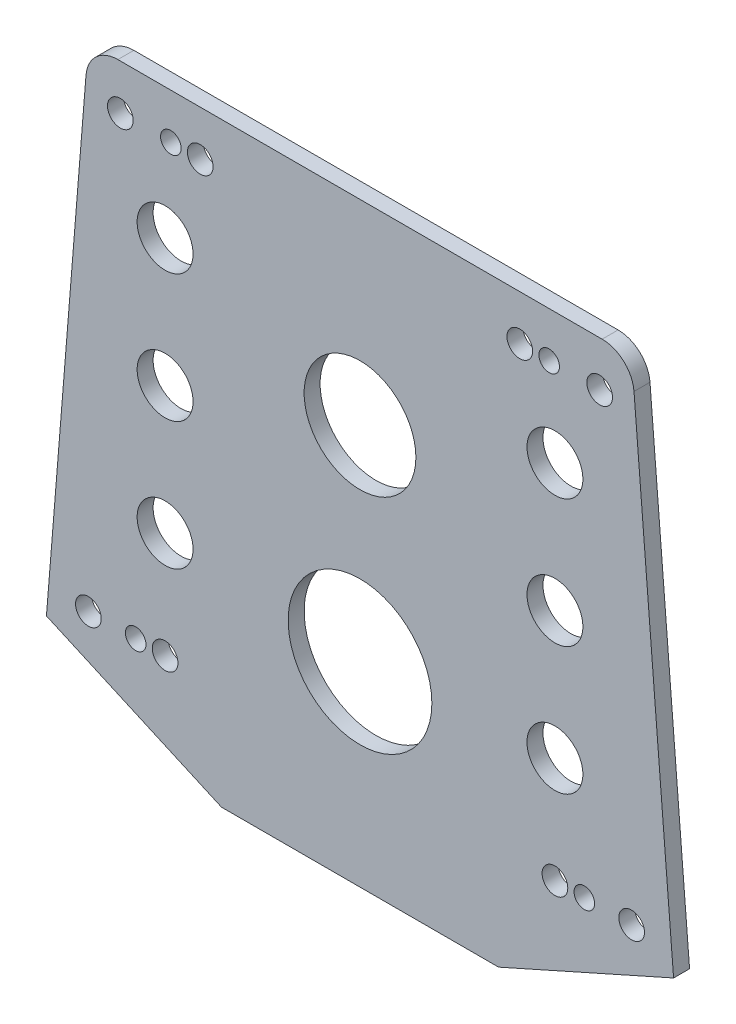
ISO-10303-21;
HEADER;
FILE_DESCRIPTION(('STEP AP214'),'2;1');
FILE_NAME('part.step','',(''),(''),'','','');
FILE_SCHEMA(('AUTOMOTIVE_DESIGN { 1 0 10303 214 1 1 1 1 }'));
ENDSEC;
DATA;
#1=APPLICATION_CONTEXT('core data for automotive mechanical design processes');
#2=APPLICATION_PROTOCOL_DEFINITION('international standard','automotive_design',2000,#1);
#3=PRODUCT_CONTEXT('',#1,'mechanical');
#4=PRODUCT('Part','Part','',(#3));
#5=PRODUCT_RELATED_PRODUCT_CATEGORY('part','',(#4));
#6=PRODUCT_DEFINITION_FORMATION('','',#4);
#7=PRODUCT_DEFINITION_CONTEXT('part definition',#1,'design');
#8=PRODUCT_DEFINITION('design','',#6,#7);
#9=PRODUCT_DEFINITION_SHAPE('','',#8);
#10=(LENGTH_UNIT() NAMED_UNIT(*) SI_UNIT(.MILLI.,.METRE.));
#11=(NAMED_UNIT(*) PLANE_ANGLE_UNIT() SI_UNIT($,.RADIAN.));
#12=(NAMED_UNIT(*) SI_UNIT($,.STERADIAN.) SOLID_ANGLE_UNIT());
#13=UNCERTAINTY_MEASURE_WITH_UNIT(LENGTH_MEASURE(1.E-05),#10,'distance_accuracy_value','');
#14=(GEOMETRIC_REPRESENTATION_CONTEXT(3) GLOBAL_UNCERTAINTY_ASSIGNED_CONTEXT((#13)) GLOBAL_UNIT_ASSIGNED_CONTEXT((#10,
#11,#12)) REPRESENTATION_CONTEXT('',''));
#15=CARTESIAN_POINT('',(0.,0.,0.));
#16=DIRECTION('',(0.,0.,1.));
#17=DIRECTION('',(1.,0.,0.));
#18=AXIS2_PLACEMENT_3D('',#15,#16,#17);
#19=CARTESIAN_POINT('',(53.975,60.325,3.175));
#20=DIRECTION('',(0.,0.,1.));
#21=DIRECTION('',(1.,0.,0.));
#22=AXIS2_PLACEMENT_3D('',#19,#20,#21);
#23=PLANE('',#22);
#24=DIRECTION('',(-1.,0.,0.));
#25=VECTOR('',#24,1.);
#26=CARTESIAN_POINT('',(-88.9,-58.039,3.175));
#27=LINE('',#26,#25);
#28=CARTESIAN_POINT('',(27.5348803710732,-58.039,3.175));
#29=VERTEX_POINT('',#28);
#30=CARTESIAN_POINT('',(-27.5348803710732,-58.039,3.175));
#31=VERTEX_POINT('',#30);
#32=EDGE_CURVE('E296',#29,#31,#27,.T.);
#33=ORIENTED_EDGE('',*,*,#32,.F.);
#34=DIRECTION('',(0.913200017994137,0.407511628221217,0.));
#35=VECTOR('',#34,1.);
#36=CARTESIAN_POINT('',(93.6321370267016,-28.5433800372946,3.175));
#37=LINE('',#36,#35);
#38=CARTESIAN_POINT('',(62.3137103942958,-42.5190948629817,3.175));
#39=VERTEX_POINT('',#38);
#40=EDGE_CURVE('E140',#29,#39,#37,.T.);
#41=ORIENTED_EDGE('',*,*,#40,.T.);
#42=DIRECTION('',(-0.0808158687660548,0.996729048114676,0.));
#43=VECTOR('',#42,1.);
#44=CARTESIAN_POINT('',(63.5,-57.1500000000001,3.175));
#45=LINE('',#44,#43);
#46=CARTESIAN_POINT('',(54.4482556135137,54.4881807666645,3.175));
#47=VERTEX_POINT('',#46);
#48=EDGE_CURVE('E171',#47,#39,#45,.F.);
#49=ORIENTED_EDGE('',*,*,#48,.F.);
#50=CARTESIAN_POINT('',(48.1190261579855,53.975,3.175));
#51=DIRECTION('',(0.,0.,1.));
#52=DIRECTION('',(1.,0.,0.));
#53=AXIS2_PLACEMENT_3D('',#50,#51,#52);
#54=CIRCLE('',#53,6.35);
#55=CARTESIAN_POINT('',(48.1190261579855,60.325,3.175));
#56=VERTEX_POINT('',#55);
#57=EDGE_CURVE('E173',#56,#47,#54,.F.);
#58=ORIENTED_EDGE('',*,*,#57,.F.);
#59=DIRECTION('',(-1.,0.,0.));
#60=VECTOR('',#59,1.);
#61=CARTESIAN_POINT('',(53.975,60.325,3.175));
#62=LINE('',#61,#60);
#63=CARTESIAN_POINT('',(-48.1190261579855,60.325,3.175));
#64=VERTEX_POINT('',#63);
#65=EDGE_CURVE('E169',#64,#56,#62,.F.);
#66=ORIENTED_EDGE('',*,*,#65,.F.);
#67=CARTESIAN_POINT('',(-48.1190261579855,53.975,3.175));
#68=DIRECTION('',(0.,0.,1.));
#69=DIRECTION('',(1.,0.,0.));
#70=AXIS2_PLACEMENT_3D('',#67,#68,#69);
#71=CIRCLE('',#70,6.35);
#72=CARTESIAN_POINT('',(-54.4482556135137,54.4881807666644,3.175));
#73=VERTEX_POINT('',#72);
#74=EDGE_CURVE('E108',#73,#64,#71,.F.);
#75=ORIENTED_EDGE('',*,*,#74,.F.);
#76=DIRECTION('',(-0.0808158687660548,-0.996729048114676,0.));
#77=VECTOR('',#76,1.);
#78=CARTESIAN_POINT('',(-53.975,60.325,3.175));
#79=LINE('',#78,#77);
#80=CARTESIAN_POINT('',(-62.3137103942958,-42.5190948629817,3.175));
#81=VERTEX_POINT('',#80);
#82=EDGE_CURVE('E112',#81,#73,#79,.F.);
#83=ORIENTED_EDGE('',*,*,#82,.F.);
#84=DIRECTION('',(0.913200017994137,-0.407511628221217,0.));
#85=VECTOR('',#84,1.);
#86=CARTESIAN_POINT('',(-3.60893227097961,-68.7158526882224,3.175));
#87=LINE('',#86,#85);
#88=EDGE_CURVE('E159',#81,#31,#87,.T.);
#89=ORIENTED_EDGE('',*,*,#88,.T.);
#90=EDGE_LOOP('',(#33,#41,#49,#58,#66,#75,#83,#89));
#91=FACE_BOUND('',#90,.T.);
#92=CARTESIAN_POINT('',(-44.577,-37.5652630866725,3.175));
#93=DIRECTION('',(0.,0.,1.));
#94=DIRECTION('',(1.,0.,0.));
#95=AXIS2_PLACEMENT_3D('',#92,#93,#94);
#96=CIRCLE('',#95,2.04470000000002);
#97=CARTESIAN_POINT('',(-42.5323,-37.5652630866725,3.175));
#98=VERTEX_POINT('',#97);
#99=EDGE_CURVE('E174',#98,#98,#96,.F.);
#100=ORIENTED_EDGE('',*,*,#99,.T.);
#101=EDGE_LOOP('',(#100));
#102=FACE_BOUND('',#101,.T.);
#103=CARTESIAN_POINT('',(37.592,51.3347369133275,3.175));
#104=DIRECTION('',(0.,0.,1.));
#105=DIRECTION('',(1.,0.,0.));
#106=AXIS2_PLACEMENT_3D('',#103,#104,#105);
#107=CIRCLE('',#106,2.04470000000002);
#108=CARTESIAN_POINT('',(39.6367,51.3347369133275,3.175));
#109=VERTEX_POINT('',#108);
#110=EDGE_CURVE('E240',#109,#109,#107,.F.);
#111=ORIENTED_EDGE('',*,*,#110,.T.);
#112=EDGE_LOOP('',(#111));
#113=FACE_BOUND('',#112,.T.);
#114=CARTESIAN_POINT('',(53.975,-37.5652630866725,3.175));
#115=DIRECTION('',(0.,0.,1.));
#116=DIRECTION('',(1.,0.,0.));
#117=AXIS2_PLACEMENT_3D('',#114,#115,#116);
#118=CIRCLE('',#117,2.55270000000001);
#119=CARTESIAN_POINT('',(56.5277,-37.5652630866725,3.175));
#120=VERTEX_POINT('',#119);
#121=EDGE_CURVE('E243',#120,#120,#118,.F.);
#122=ORIENTED_EDGE('',*,*,#121,.T.);
#123=EDGE_LOOP('',(#122));
#124=FACE_BOUND('',#123,.T.);
#125=CARTESIAN_POINT('',(47.625,51.3347369133275,3.175));
#126=DIRECTION('',(0.,0.,1.));
#127=DIRECTION('',(1.,0.,0.));
#128=AXIS2_PLACEMENT_3D('',#125,#126,#127);
#129=CIRCLE('',#128,2.55270000000001);
#130=CARTESIAN_POINT('',(50.1777,51.3347369133275,3.175));
#131=VERTEX_POINT('',#130);
#132=EDGE_CURVE('E246',#131,#131,#129,.F.);
#133=ORIENTED_EDGE('',*,*,#132,.T.);
#134=EDGE_LOOP('',(#133));
#135=FACE_BOUND('',#134,.T.);
#136=CARTESIAN_POINT('',(-38.735,-37.5652630866725,3.175));
#137=DIRECTION('',(0.,0.,1.));
#138=DIRECTION('',(1.,0.,0.));
#139=AXIS2_PLACEMENT_3D('',#136,#137,#138);
#140=CIRCLE('',#139,2.55270000000001);
#141=CARTESIAN_POINT('',(-36.1823,-37.5652630866725,3.175));
#142=VERTEX_POINT('',#141);
#143=EDGE_CURVE('E249',#142,#142,#140,.F.);
#144=ORIENTED_EDGE('',*,*,#143,.T.);
#145=EDGE_LOOP('',(#144));
#146=FACE_BOUND('',#145,.T.);
#147=CARTESIAN_POINT('',(31.75,51.3347369133275,3.175));
#148=DIRECTION('',(0.,0.,1.));
#149=DIRECTION('',(1.,0.,0.));
#150=AXIS2_PLACEMENT_3D('',#147,#148,#149);
#151=CIRCLE('',#150,2.55270000000001);
#152=CARTESIAN_POINT('',(34.3027,51.3347369133275,3.175));
#153=VERTEX_POINT('',#152);
#154=EDGE_CURVE('E252',#153,#153,#151,.F.);
#155=ORIENTED_EDGE('',*,*,#154,.T.);
#156=EDGE_LOOP('',(#155));
#157=FACE_BOUND('',#156,.T.);
#158=CARTESIAN_POINT('',(0.,-19.2532,3.175));
#159=DIRECTION('',(0.,0.,1.));
#160=DIRECTION('',(1.,0.,0.));
#161=AXIS2_PLACEMENT_3D('',#158,#159,#160);
#162=CIRCLE('',#161,14.28115);
#163=CARTESIAN_POINT('',(14.28115,-19.2532,3.175));
#164=VERTEX_POINT('',#163);
#165=EDGE_CURVE('E255',#164,#164,#162,.F.);
#166=ORIENTED_EDGE('',*,*,#165,.T.);
#167=EDGE_LOOP('',(#166));
#168=FACE_BOUND('',#167,.T.);
#169=CARTESIAN_POINT('',(38.735,8.91673691332753,3.175));
#170=DIRECTION('',(0.,0.,1.));
#171=DIRECTION('',(1.,0.,0.));
#172=AXIS2_PLACEMENT_3D('',#169,#170,#171);
#173=CIRCLE('',#172,5.55625000000001);
#174=CARTESIAN_POINT('',(44.29125,8.91673691332753,3.175));
#175=VERTEX_POINT('',#174);
#176=EDGE_CURVE('E258',#175,#175,#173,.F.);
#177=ORIENTED_EDGE('',*,*,#176,.T.);
#178=EDGE_LOOP('',(#177));
#179=FACE_BOUND('',#178,.T.);
#180=CARTESIAN_POINT('',(-38.735,-16.4832630866725,3.175));
#181=DIRECTION('',(0.,0.,1.));
#182=DIRECTION('',(1.,0.,0.));
#183=AXIS2_PLACEMENT_3D('',#180,#181,#182);
#184=CIRCLE('',#183,5.55625000000001);
#185=CARTESIAN_POINT('',(-33.17875,-16.4832630866725,3.175));
#186=VERTEX_POINT('',#185);
#187=EDGE_CURVE('E261',#186,#186,#184,.F.);
#188=ORIENTED_EDGE('',*,*,#187,.T.);
#189=EDGE_LOOP('',(#188));
#190=FACE_BOUND('',#189,.T.);
#191=CARTESIAN_POINT('',(-38.735,8.91673691332752,3.175));
#192=DIRECTION('',(0.,0.,1.));
#193=DIRECTION('',(1.,0.,0.));
#194=AXIS2_PLACEMENT_3D('',#191,#192,#193);
#195=CIRCLE('',#194,5.55625000000001);
#196=CARTESIAN_POINT('',(-33.17875,8.91673691332752,3.175));
#197=VERTEX_POINT('',#196);
#198=EDGE_CURVE('E264',#197,#197,#195,.F.);
#199=ORIENTED_EDGE('',*,*,#198,.T.);
#200=EDGE_LOOP('',(#199));
#201=FACE_BOUND('',#200,.T.);
#202=CARTESIAN_POINT('',(0.,21.463,3.175));
#203=DIRECTION('',(0.,0.,1.));
#204=DIRECTION('',(1.,0.,0.));
#205=AXIS2_PLACEMENT_3D('',#202,#203,#204);
#206=CIRCLE('',#205,11.10615);
#207=CARTESIAN_POINT('',(11.10615,21.463,3.175));
#208=VERTEX_POINT('',#207);
#209=EDGE_CURVE('E267',#208,#208,#206,.F.);
#210=ORIENTED_EDGE('',*,*,#209,.T.);
#211=EDGE_LOOP('',(#210));
#212=FACE_BOUND('',#211,.T.);
#213=CARTESIAN_POINT('',(-38.735,34.3167369133275,3.175));
#214=DIRECTION('',(0.,0.,1.));
#215=DIRECTION('',(1.,0.,0.));
#216=AXIS2_PLACEMENT_3D('',#213,#214,#215);
#217=CIRCLE('',#216,5.55625000000001);
#218=CARTESIAN_POINT('',(-33.17875,34.3167369133275,3.175));
#219=VERTEX_POINT('',#218);
#220=EDGE_CURVE('E270',#219,#219,#217,.F.);
#221=ORIENTED_EDGE('',*,*,#220,.T.);
#222=EDGE_LOOP('',(#221));
#223=FACE_BOUND('',#222,.T.);
#224=CARTESIAN_POINT('',(38.735,-16.4832630866725,3.175));
#225=DIRECTION('',(0.,0.,1.));
#226=DIRECTION('',(1.,0.,0.));
#227=AXIS2_PLACEMENT_3D('',#224,#225,#226);
#228=CIRCLE('',#227,5.55625000000001);
#229=CARTESIAN_POINT('',(44.29125,-16.4832630866725,3.175));
#230=VERTEX_POINT('',#229);
#231=EDGE_CURVE('E273',#230,#230,#228,.F.);
#232=ORIENTED_EDGE('',*,*,#231,.T.);
#233=EDGE_LOOP('',(#232));
#234=FACE_BOUND('',#233,.T.);
#235=CARTESIAN_POINT('',(38.735,34.3167369133275,3.175));
#236=DIRECTION('',(0.,0.,1.));
#237=DIRECTION('',(1.,0.,0.));
#238=AXIS2_PLACEMENT_3D('',#235,#236,#237);
#239=CIRCLE('',#238,5.55625000000001);
#240=CARTESIAN_POINT('',(44.29125,34.3167369133275,3.175));
#241=VERTEX_POINT('',#240);
#242=EDGE_CURVE('E276',#241,#241,#239,.F.);
#243=ORIENTED_EDGE('',*,*,#242,.T.);
#244=EDGE_LOOP('',(#243));
#245=FACE_BOUND('',#244,.T.);
#246=CARTESIAN_POINT('',(-31.75,51.3347369133275,3.175));
#247=DIRECTION('',(0.,0.,1.));
#248=DIRECTION('',(1.,0.,0.));
#249=AXIS2_PLACEMENT_3D('',#246,#247,#248);
#250=CIRCLE('',#249,2.55270000000001);
#251=CARTESIAN_POINT('',(-29.1973,51.3347369133275,3.175));
#252=VERTEX_POINT('',#251);
#253=EDGE_CURVE('E279',#252,#252,#250,.F.);
#254=ORIENTED_EDGE('',*,*,#253,.T.);
#255=EDGE_LOOP('',(#254));
#256=FACE_BOUND('',#255,.T.);
#257=CARTESIAN_POINT('',(38.735,-37.5652630866725,3.175));
#258=DIRECTION('',(0.,0.,1.));
#259=DIRECTION('',(1.,0.,0.));
#260=AXIS2_PLACEMENT_3D('',#257,#258,#259);
#261=CIRCLE('',#260,2.55270000000001);
#262=CARTESIAN_POINT('',(41.2877,-37.5652630866725,3.175));
#263=VERTEX_POINT('',#262);
#264=EDGE_CURVE('E282',#263,#263,#261,.F.);
#265=ORIENTED_EDGE('',*,*,#264,.T.);
#266=EDGE_LOOP('',(#265));
#267=FACE_BOUND('',#266,.T.);
#268=CARTESIAN_POINT('',(-47.625,51.3347369133275,3.175));
#269=DIRECTION('',(0.,0.,1.));
#270=DIRECTION('',(1.,0.,0.));
#271=AXIS2_PLACEMENT_3D('',#268,#269,#270);
#272=CIRCLE('',#271,2.55270000000001);
#273=CARTESIAN_POINT('',(-45.0723,51.3347369133275,3.175));
#274=VERTEX_POINT('',#273);
#275=EDGE_CURVE('E285',#274,#274,#272,.F.);
#276=ORIENTED_EDGE('',*,*,#275,.T.);
#277=EDGE_LOOP('',(#276));
#278=FACE_BOUND('',#277,.T.);
#279=CARTESIAN_POINT('',(-53.975,-37.5652630866725,3.175));
#280=DIRECTION('',(0.,0.,1.));
#281=DIRECTION('',(1.,0.,0.));
#282=AXIS2_PLACEMENT_3D('',#279,#280,#281);
#283=CIRCLE('',#282,2.55270000000001);
#284=CARTESIAN_POINT('',(-51.4223,-37.5652630866725,3.175));
#285=VERTEX_POINT('',#284);
#286=EDGE_CURVE('E288',#285,#285,#283,.F.);
#287=ORIENTED_EDGE('',*,*,#286,.T.);
#288=EDGE_LOOP('',(#287));
#289=FACE_BOUND('',#288,.T.);
#290=CARTESIAN_POINT('',(-37.592,51.3347369133275,3.175));
#291=DIRECTION('',(0.,0.,1.));
#292=DIRECTION('',(1.,0.,0.));
#293=AXIS2_PLACEMENT_3D('',#290,#291,#292);
#294=CIRCLE('',#293,2.04470000000002);
#295=CARTESIAN_POINT('',(-35.5473,51.3347369133275,3.175));
#296=VERTEX_POINT('',#295);
#297=EDGE_CURVE('E291',#296,#296,#294,.F.);
#298=ORIENTED_EDGE('',*,*,#297,.T.);
#299=EDGE_LOOP('',(#298));
#300=FACE_BOUND('',#299,.T.);
#301=CARTESIAN_POINT('',(44.577,-37.5652630866725,3.175));
#302=DIRECTION('',(0.,0.,1.));
#303=DIRECTION('',(1.,0.,0.));
#304=AXIS2_PLACEMENT_3D('',#301,#302,#303);
#305=CIRCLE('',#304,2.04470000000002);
#306=CARTESIAN_POINT('',(46.6217,-37.5652630866725,3.175));
#307=VERTEX_POINT('',#306);
#308=EDGE_CURVE('E294',#307,#307,#305,.F.);
#309=ORIENTED_EDGE('',*,*,#308,.T.);
#310=EDGE_LOOP('',(#309));
#311=FACE_BOUND('',#310,.T.);
#312=ADVANCED_FACE('F36',(#91,#102,#113,#124,#135,#146,#157,#168,#179,#190,#201,#212,#223,#234,
#245,#256,#267,#278,#289,#300,#311),#23,.T.);
#313=CARTESIAN_POINT('',(44.577,-37.5652630866725,3.175));
#314=DIRECTION('',(0.,0.,1.));
#315=DIRECTION('',(1.,0.,0.));
#316=AXIS2_PLACEMENT_3D('',#313,#314,#315);
#317=CYLINDRICAL_SURFACE('',#316,2.04470000000002);
#318=CARTESIAN_POINT('',(44.577,-37.5652630866725,0.));
#319=DIRECTION('',(0.,0.,1.));
#320=DIRECTION('',(1.,0.,0.));
#321=AXIS2_PLACEMENT_3D('',#318,#319,#320);
#322=CIRCLE('',#321,2.04470000000002);
#323=CARTESIAN_POINT('',(46.6217,-37.5652630866725,0.));
#324=VERTEX_POINT('',#323);
#325=EDGE_CURVE('E233',#324,#324,#322,.F.);
#326=ORIENTED_EDGE('',*,*,#325,.T.);
#327=EDGE_LOOP('',(#326));
#328=FACE_BOUND('',#327,.T.);
#329=ORIENTED_EDGE('',*,*,#308,.F.);
#330=EDGE_LOOP('',(#329));
#331=FACE_BOUND('',#330,.T.);
#332=ADVANCED_FACE('F387',(#328,#331),#317,.F.);
#333=CARTESIAN_POINT('',(-37.592,51.3347369133275,3.175));
#334=DIRECTION('',(0.,0.,1.));
#335=DIRECTION('',(1.,0.,0.));
#336=AXIS2_PLACEMENT_3D('',#333,#334,#335);
#337=CYLINDRICAL_SURFACE('',#336,2.04470000000002);
#338=CARTESIAN_POINT('',(-37.592,51.3347369133275,0.));
#339=DIRECTION('',(0.,0.,1.));
#340=DIRECTION('',(1.,0.,0.));
#341=AXIS2_PLACEMENT_3D('',#338,#339,#340);
#342=CIRCLE('',#341,2.04470000000002);
#343=CARTESIAN_POINT('',(-35.5473,51.3347369133275,0.));
#344=VERTEX_POINT('',#343);
#345=EDGE_CURVE('E230',#344,#344,#342,.F.);
#346=ORIENTED_EDGE('',*,*,#345,.T.);
#347=EDGE_LOOP('',(#346));
#348=FACE_BOUND('',#347,.T.);
#349=ORIENTED_EDGE('',*,*,#297,.F.);
#350=EDGE_LOOP('',(#349));
#351=FACE_BOUND('',#350,.T.);
#352=ADVANCED_FACE('F390',(#348,#351),#337,.F.);
#353=CARTESIAN_POINT('',(-53.975,-37.5652630866725,3.175));
#354=DIRECTION('',(0.,0.,1.));
#355=DIRECTION('',(1.,0.,0.));
#356=AXIS2_PLACEMENT_3D('',#353,#354,#355);
#357=CYLINDRICAL_SURFACE('',#356,2.55270000000001);
#358=CARTESIAN_POINT('',(-53.975,-37.5652630866725,0.));
#359=DIRECTION('',(0.,0.,1.));
#360=DIRECTION('',(1.,0.,0.));
#361=AXIS2_PLACEMENT_3D('',#358,#359,#360);
#362=CIRCLE('',#361,2.55270000000001);
#363=CARTESIAN_POINT('',(-51.4223,-37.5652630866725,0.));
#364=VERTEX_POINT('',#363);
#365=EDGE_CURVE('E227',#364,#364,#362,.F.);
#366=ORIENTED_EDGE('',*,*,#365,.T.);
#367=EDGE_LOOP('',(#366));
#368=FACE_BOUND('',#367,.T.);
#369=ORIENTED_EDGE('',*,*,#286,.F.);
#370=EDGE_LOOP('',(#369));
#371=FACE_BOUND('',#370,.T.);
#372=ADVANCED_FACE('F394',(#368,#371),#357,.F.);
#373=CARTESIAN_POINT('',(-47.625,51.3347369133275,3.175));
#374=DIRECTION('',(0.,0.,1.));
#375=DIRECTION('',(1.,0.,0.));
#376=AXIS2_PLACEMENT_3D('',#373,#374,#375);
#377=CYLINDRICAL_SURFACE('',#376,2.55270000000001);
#378=CARTESIAN_POINT('',(-47.625,51.3347369133275,0.));
#379=DIRECTION('',(0.,0.,1.));
#380=DIRECTION('',(1.,0.,0.));
#381=AXIS2_PLACEMENT_3D('',#378,#379,#380);
#382=CIRCLE('',#381,2.55270000000001);
#383=CARTESIAN_POINT('',(-45.0723,51.3347369133275,0.));
#384=VERTEX_POINT('',#383);
#385=EDGE_CURVE('E224',#384,#384,#382,.F.);
#386=ORIENTED_EDGE('',*,*,#385,.T.);
#387=EDGE_LOOP('',(#386));
#388=FACE_BOUND('',#387,.T.);
#389=ORIENTED_EDGE('',*,*,#275,.F.);
#390=EDGE_LOOP('',(#389));
#391=FACE_BOUND('',#390,.T.);
#392=ADVANCED_FACE('F398',(#388,#391),#377,.F.);
#393=CARTESIAN_POINT('',(38.735,-37.5652630866725,3.175));
#394=DIRECTION('',(0.,0.,1.));
#395=DIRECTION('',(1.,0.,0.));
#396=AXIS2_PLACEMENT_3D('',#393,#394,#395);
#397=CYLINDRICAL_SURFACE('',#396,2.55270000000001);
#398=CARTESIAN_POINT('',(38.735,-37.5652630866725,0.));
#399=DIRECTION('',(0.,0.,1.));
#400=DIRECTION('',(1.,0.,0.));
#401=AXIS2_PLACEMENT_3D('',#398,#399,#400);
#402=CIRCLE('',#401,2.55270000000001);
#403=CARTESIAN_POINT('',(41.2877,-37.5652630866725,0.));
#404=VERTEX_POINT('',#403);
#405=EDGE_CURVE('E221',#404,#404,#402,.F.);
#406=ORIENTED_EDGE('',*,*,#405,.T.);
#407=EDGE_LOOP('',(#406));
#408=FACE_BOUND('',#407,.T.);
#409=ORIENTED_EDGE('',*,*,#264,.F.);
#410=EDGE_LOOP('',(#409));
#411=FACE_BOUND('',#410,.T.);
#412=ADVANCED_FACE('F402',(#408,#411),#397,.F.);
#413=CARTESIAN_POINT('',(-31.75,51.3347369133275,3.175));
#414=DIRECTION('',(0.,0.,1.));
#415=DIRECTION('',(1.,0.,0.));
#416=AXIS2_PLACEMENT_3D('',#413,#414,#415);
#417=CYLINDRICAL_SURFACE('',#416,2.55270000000001);
#418=CARTESIAN_POINT('',(-31.75,51.3347369133275,0.));
#419=DIRECTION('',(0.,0.,1.));
#420=DIRECTION('',(1.,0.,0.));
#421=AXIS2_PLACEMENT_3D('',#418,#419,#420);
#422=CIRCLE('',#421,2.55270000000001);
#423=CARTESIAN_POINT('',(-29.1973,51.3347369133275,0.));
#424=VERTEX_POINT('',#423);
#425=EDGE_CURVE('E218',#424,#424,#422,.F.);
#426=ORIENTED_EDGE('',*,*,#425,.T.);
#427=EDGE_LOOP('',(#426));
#428=FACE_BOUND('',#427,.T.);
#429=ORIENTED_EDGE('',*,*,#253,.F.);
#430=EDGE_LOOP('',(#429));
#431=FACE_BOUND('',#430,.T.);
#432=ADVANCED_FACE('F406',(#428,#431),#417,.F.);
#433=CARTESIAN_POINT('',(38.735,34.3167369133275,3.175));
#434=DIRECTION('',(0.,0.,1.));
#435=DIRECTION('',(1.,0.,0.));
#436=AXIS2_PLACEMENT_3D('',#433,#434,#435);
#437=CYLINDRICAL_SURFACE('',#436,5.55625000000001);
#438=CARTESIAN_POINT('',(38.735,34.3167369133275,0.));
#439=DIRECTION('',(0.,0.,1.));
#440=DIRECTION('',(1.,0.,0.));
#441=AXIS2_PLACEMENT_3D('',#438,#439,#440);
#442=CIRCLE('',#441,5.55625000000001);
#443=CARTESIAN_POINT('',(44.29125,34.3167369133275,0.));
#444=VERTEX_POINT('',#443);
#445=EDGE_CURVE('E215',#444,#444,#442,.F.);
#446=ORIENTED_EDGE('',*,*,#445,.T.);
#447=EDGE_LOOP('',(#446));
#448=FACE_BOUND('',#447,.T.);
#449=ORIENTED_EDGE('',*,*,#242,.F.);
#450=EDGE_LOOP('',(#449));
#451=FACE_BOUND('',#450,.T.);
#452=ADVANCED_FACE('F410',(#448,#451),#437,.F.);
#453=CARTESIAN_POINT('',(38.735,-16.4832630866725,3.175));
#454=DIRECTION('',(0.,0.,1.));
#455=DIRECTION('',(1.,0.,0.));
#456=AXIS2_PLACEMENT_3D('',#453,#454,#455);
#457=CYLINDRICAL_SURFACE('',#456,5.55625000000001);
#458=CARTESIAN_POINT('',(38.735,-16.4832630866725,0.));
#459=DIRECTION('',(0.,0.,1.));
#460=DIRECTION('',(1.,0.,0.));
#461=AXIS2_PLACEMENT_3D('',#458,#459,#460);
#462=CIRCLE('',#461,5.55625000000001);
#463=CARTESIAN_POINT('',(44.29125,-16.4832630866725,0.));
#464=VERTEX_POINT('',#463);
#465=EDGE_CURVE('E212',#464,#464,#462,.F.);
#466=ORIENTED_EDGE('',*,*,#465,.T.);
#467=EDGE_LOOP('',(#466));
#468=FACE_BOUND('',#467,.T.);
#469=ORIENTED_EDGE('',*,*,#231,.F.);
#470=EDGE_LOOP('',(#469));
#471=FACE_BOUND('',#470,.T.);
#472=ADVANCED_FACE('F414',(#468,#471),#457,.F.);
#473=CARTESIAN_POINT('',(-38.735,34.3167369133275,3.175));
#474=DIRECTION('',(0.,0.,1.));
#475=DIRECTION('',(1.,0.,0.));
#476=AXIS2_PLACEMENT_3D('',#473,#474,#475);
#477=CYLINDRICAL_SURFACE('',#476,5.55625000000001);
#478=CARTESIAN_POINT('',(-38.735,34.3167369133275,0.));
#479=DIRECTION('',(0.,0.,1.));
#480=DIRECTION('',(1.,0.,0.));
#481=AXIS2_PLACEMENT_3D('',#478,#479,#480);
#482=CIRCLE('',#481,5.55625000000001);
#483=CARTESIAN_POINT('',(-33.17875,34.3167369133275,0.));
#484=VERTEX_POINT('',#483);
#485=EDGE_CURVE('E209',#484,#484,#482,.F.);
#486=ORIENTED_EDGE('',*,*,#485,.T.);
#487=EDGE_LOOP('',(#486));
#488=FACE_BOUND('',#487,.T.);
#489=ORIENTED_EDGE('',*,*,#220,.F.);
#490=EDGE_LOOP('',(#489));
#491=FACE_BOUND('',#490,.T.);
#492=ADVANCED_FACE('F418',(#488,#491),#477,.F.);
#493=CARTESIAN_POINT('',(0.,21.463,3.175));
#494=DIRECTION('',(0.,0.,1.));
#495=DIRECTION('',(1.,0.,0.));
#496=AXIS2_PLACEMENT_3D('',#493,#494,#495);
#497=CYLINDRICAL_SURFACE('',#496,11.10615);
#498=CARTESIAN_POINT('',(0.,21.463,0.));
#499=DIRECTION('',(0.,0.,1.));
#500=DIRECTION('',(1.,0.,0.));
#501=AXIS2_PLACEMENT_3D('',#498,#499,#500);
#502=CIRCLE('',#501,11.10615);
#503=CARTESIAN_POINT('',(11.10615,21.463,0.));
#504=VERTEX_POINT('',#503);
#505=EDGE_CURVE('E206',#504,#504,#502,.F.);
#506=ORIENTED_EDGE('',*,*,#505,.T.);
#507=EDGE_LOOP('',(#506));
#508=FACE_BOUND('',#507,.T.);
#509=ORIENTED_EDGE('',*,*,#209,.F.);
#510=EDGE_LOOP('',(#509));
#511=FACE_BOUND('',#510,.T.);
#512=ADVANCED_FACE('F422',(#508,#511),#497,.F.);
#513=CARTESIAN_POINT('',(-38.735,8.91673691332752,3.175));
#514=DIRECTION('',(0.,0.,1.));
#515=DIRECTION('',(1.,0.,0.));
#516=AXIS2_PLACEMENT_3D('',#513,#514,#515);
#517=CYLINDRICAL_SURFACE('',#516,5.55625000000001);
#518=CARTESIAN_POINT('',(-38.735,8.91673691332752,0.));
#519=DIRECTION('',(0.,0.,1.));
#520=DIRECTION('',(1.,0.,0.));
#521=AXIS2_PLACEMENT_3D('',#518,#519,#520);
#522=CIRCLE('',#521,5.55625000000001);
#523=CARTESIAN_POINT('',(-33.17875,8.91673691332752,0.));
#524=VERTEX_POINT('',#523);
#525=EDGE_CURVE('E203',#524,#524,#522,.F.);
#526=ORIENTED_EDGE('',*,*,#525,.T.);
#527=EDGE_LOOP('',(#526));
#528=FACE_BOUND('',#527,.T.);
#529=ORIENTED_EDGE('',*,*,#198,.F.);
#530=EDGE_LOOP('',(#529));
#531=FACE_BOUND('',#530,.T.);
#532=ADVANCED_FACE('F426',(#528,#531),#517,.F.);
#533=CARTESIAN_POINT('',(-38.735,-16.4832630866725,3.175));
#534=DIRECTION('',(0.,0.,1.));
#535=DIRECTION('',(1.,0.,0.));
#536=AXIS2_PLACEMENT_3D('',#533,#534,#535);
#537=CYLINDRICAL_SURFACE('',#536,5.55625000000001);
#538=CARTESIAN_POINT('',(-38.735,-16.4832630866725,0.));
#539=DIRECTION('',(0.,0.,1.));
#540=DIRECTION('',(1.,0.,0.));
#541=AXIS2_PLACEMENT_3D('',#538,#539,#540);
#542=CIRCLE('',#541,5.55625000000001);
#543=CARTESIAN_POINT('',(-33.17875,-16.4832630866725,0.));
#544=VERTEX_POINT('',#543);
#545=EDGE_CURVE('E200',#544,#544,#542,.F.);
#546=ORIENTED_EDGE('',*,*,#545,.T.);
#547=EDGE_LOOP('',(#546));
#548=FACE_BOUND('',#547,.T.);
#549=ORIENTED_EDGE('',*,*,#187,.F.);
#550=EDGE_LOOP('',(#549));
#551=FACE_BOUND('',#550,.T.);
#552=ADVANCED_FACE('F430',(#548,#551),#537,.F.);
#553=CARTESIAN_POINT('',(38.735,8.91673691332753,3.175));
#554=DIRECTION('',(0.,0.,1.));
#555=DIRECTION('',(1.,0.,0.));
#556=AXIS2_PLACEMENT_3D('',#553,#554,#555);
#557=CYLINDRICAL_SURFACE('',#556,5.55625000000001);
#558=CARTESIAN_POINT('',(38.735,8.91673691332753,0.));
#559=DIRECTION('',(0.,0.,1.));
#560=DIRECTION('',(1.,0.,0.));
#561=AXIS2_PLACEMENT_3D('',#558,#559,#560);
#562=CIRCLE('',#561,5.55625000000001);
#563=CARTESIAN_POINT('',(44.29125,8.91673691332753,0.));
#564=VERTEX_POINT('',#563);
#565=EDGE_CURVE('E197',#564,#564,#562,.F.);
#566=ORIENTED_EDGE('',*,*,#565,.T.);
#567=EDGE_LOOP('',(#566));
#568=FACE_BOUND('',#567,.T.);
#569=ORIENTED_EDGE('',*,*,#176,.F.);
#570=EDGE_LOOP('',(#569));
#571=FACE_BOUND('',#570,.T.);
#572=ADVANCED_FACE('F434',(#568,#571),#557,.F.);
#573=CARTESIAN_POINT('',(0.,-19.2532,3.175));
#574=DIRECTION('',(0.,0.,1.));
#575=DIRECTION('',(1.,0.,0.));
#576=AXIS2_PLACEMENT_3D('',#573,#574,#575);
#577=CYLINDRICAL_SURFACE('',#576,14.28115);
#578=CARTESIAN_POINT('',(0.,-19.2532,0.));
#579=DIRECTION('',(0.,0.,1.));
#580=DIRECTION('',(1.,0.,0.));
#581=AXIS2_PLACEMENT_3D('',#578,#579,#580);
#582=CIRCLE('',#581,14.28115);
#583=CARTESIAN_POINT('',(14.28115,-19.2532,0.));
#584=VERTEX_POINT('',#583);
#585=EDGE_CURVE('E194',#584,#584,#582,.F.);
#586=ORIENTED_EDGE('',*,*,#585,.T.);
#587=EDGE_LOOP('',(#586));
#588=FACE_BOUND('',#587,.T.);
#589=ORIENTED_EDGE('',*,*,#165,.F.);
#590=EDGE_LOOP('',(#589));
#591=FACE_BOUND('',#590,.T.);
#592=ADVANCED_FACE('F438',(#588,#591),#577,.F.);
#593=CARTESIAN_POINT('',(31.75,51.3347369133275,3.175));
#594=DIRECTION('',(0.,0.,1.));
#595=DIRECTION('',(1.,0.,0.));
#596=AXIS2_PLACEMENT_3D('',#593,#594,#595);
#597=CYLINDRICAL_SURFACE('',#596,2.55270000000001);
#598=CARTESIAN_POINT('',(31.75,51.3347369133275,0.));
#599=DIRECTION('',(0.,0.,1.));
#600=DIRECTION('',(1.,0.,0.));
#601=AXIS2_PLACEMENT_3D('',#598,#599,#600);
#602=CIRCLE('',#601,2.55270000000001);
#603=CARTESIAN_POINT('',(34.3027,51.3347369133275,0.));
#604=VERTEX_POINT('',#603);
#605=EDGE_CURVE('E191',#604,#604,#602,.F.);
#606=ORIENTED_EDGE('',*,*,#605,.T.);
#607=EDGE_LOOP('',(#606));
#608=FACE_BOUND('',#607,.T.);
#609=ORIENTED_EDGE('',*,*,#154,.F.);
#610=EDGE_LOOP('',(#609));
#611=FACE_BOUND('',#610,.T.);
#612=ADVANCED_FACE('F442',(#608,#611),#597,.F.);
#613=CARTESIAN_POINT('',(-38.735,-37.5652630866725,3.175));
#614=DIRECTION('',(0.,0.,1.));
#615=DIRECTION('',(1.,0.,0.));
#616=AXIS2_PLACEMENT_3D('',#613,#614,#615);
#617=CYLINDRICAL_SURFACE('',#616,2.55270000000001);
#618=CARTESIAN_POINT('',(-38.735,-37.5652630866725,0.));
#619=DIRECTION('',(0.,0.,1.));
#620=DIRECTION('',(1.,0.,0.));
#621=AXIS2_PLACEMENT_3D('',#618,#619,#620);
#622=CIRCLE('',#621,2.55270000000001);
#623=CARTESIAN_POINT('',(-36.1823,-37.5652630866725,0.));
#624=VERTEX_POINT('',#623);
#625=EDGE_CURVE('E188',#624,#624,#622,.F.);
#626=ORIENTED_EDGE('',*,*,#625,.T.);
#627=EDGE_LOOP('',(#626));
#628=FACE_BOUND('',#627,.T.);
#629=ORIENTED_EDGE('',*,*,#143,.F.);
#630=EDGE_LOOP('',(#629));
#631=FACE_BOUND('',#630,.T.);
#632=ADVANCED_FACE('F446',(#628,#631),#617,.F.);
#633=CARTESIAN_POINT('',(47.625,51.3347369133275,3.175));
#634=DIRECTION('',(0.,0.,1.));
#635=DIRECTION('',(1.,0.,0.));
#636=AXIS2_PLACEMENT_3D('',#633,#634,#635);
#637=CYLINDRICAL_SURFACE('',#636,2.55270000000001);
#638=CARTESIAN_POINT('',(47.625,51.3347369133275,0.));
#639=DIRECTION('',(0.,0.,1.));
#640=DIRECTION('',(1.,0.,0.));
#641=AXIS2_PLACEMENT_3D('',#638,#639,#640);
#642=CIRCLE('',#641,2.55270000000001);
#643=CARTESIAN_POINT('',(50.1777,51.3347369133275,0.));
#644=VERTEX_POINT('',#643);
#645=EDGE_CURVE('E185',#644,#644,#642,.F.);
#646=ORIENTED_EDGE('',*,*,#645,.T.);
#647=EDGE_LOOP('',(#646));
#648=FACE_BOUND('',#647,.T.);
#649=ORIENTED_EDGE('',*,*,#132,.F.);
#650=EDGE_LOOP('',(#649));
#651=FACE_BOUND('',#650,.T.);
#652=ADVANCED_FACE('F450',(#648,#651),#637,.F.);
#653=CARTESIAN_POINT('',(53.975,-37.5652630866725,3.175));
#654=DIRECTION('',(0.,0.,1.));
#655=DIRECTION('',(1.,0.,0.));
#656=AXIS2_PLACEMENT_3D('',#653,#654,#655);
#657=CYLINDRICAL_SURFACE('',#656,2.55270000000001);
#658=CARTESIAN_POINT('',(53.975,-37.5652630866725,0.));
#659=DIRECTION('',(0.,0.,1.));
#660=DIRECTION('',(1.,0.,0.));
#661=AXIS2_PLACEMENT_3D('',#658,#659,#660);
#662=CIRCLE('',#661,2.55270000000001);
#663=CARTESIAN_POINT('',(56.5277,-37.5652630866725,0.));
#664=VERTEX_POINT('',#663);
#665=EDGE_CURVE('E182',#664,#664,#662,.F.);
#666=ORIENTED_EDGE('',*,*,#665,.T.);
#667=EDGE_LOOP('',(#666));
#668=FACE_BOUND('',#667,.T.);
#669=ORIENTED_EDGE('',*,*,#121,.F.);
#670=EDGE_LOOP('',(#669));
#671=FACE_BOUND('',#670,.T.);
#672=ADVANCED_FACE('F454',(#668,#671),#657,.F.);
#673=CARTESIAN_POINT('',(37.592,51.3347369133275,3.175));
#674=DIRECTION('',(0.,0.,1.));
#675=DIRECTION('',(1.,0.,0.));
#676=AXIS2_PLACEMENT_3D('',#673,#674,#675);
#677=CYLINDRICAL_SURFACE('',#676,2.04470000000002);
#678=CARTESIAN_POINT('',(37.592,51.3347369133275,0.));
#679=DIRECTION('',(0.,0.,1.));
#680=DIRECTION('',(1.,0.,0.));
#681=AXIS2_PLACEMENT_3D('',#678,#679,#680);
#682=CIRCLE('',#681,2.04470000000002);
#683=CARTESIAN_POINT('',(39.6367,51.3347369133275,0.));
#684=VERTEX_POINT('',#683);
#685=EDGE_CURVE('E179',#684,#684,#682,.F.);
#686=ORIENTED_EDGE('',*,*,#685,.T.);
#687=EDGE_LOOP('',(#686));
#688=FACE_BOUND('',#687,.T.);
#689=ORIENTED_EDGE('',*,*,#110,.F.);
#690=EDGE_LOOP('',(#689));
#691=FACE_BOUND('',#690,.T.);
#692=ADVANCED_FACE('F323',(#688,#691),#677,.F.);
#693=CARTESIAN_POINT('',(-44.577,-37.5652630866725,3.175));
#694=DIRECTION('',(0.,0.,1.));
#695=DIRECTION('',(1.,0.,0.));
#696=AXIS2_PLACEMENT_3D('',#693,#694,#695);
#697=CYLINDRICAL_SURFACE('',#696,2.04470000000002);
#698=CARTESIAN_POINT('',(-44.577,-37.5652630866725,0.));
#699=DIRECTION('',(0.,0.,1.));
#700=DIRECTION('',(1.,0.,0.));
#701=AXIS2_PLACEMENT_3D('',#698,#699,#700);
#702=CIRCLE('',#701,2.04470000000002);
#703=CARTESIAN_POINT('',(-42.5323,-37.5652630866725,0.));
#704=VERTEX_POINT('',#703);
#705=EDGE_CURVE('E139',#704,#704,#702,.F.);
#706=ORIENTED_EDGE('',*,*,#705,.T.);
#707=EDGE_LOOP('',(#706));
#708=FACE_BOUND('',#707,.T.);
#709=ORIENTED_EDGE('',*,*,#99,.F.);
#710=EDGE_LOOP('',(#709));
#711=FACE_BOUND('',#710,.T.);
#712=ADVANCED_FACE('F316',(#708,#711),#697,.F.);
#713=CARTESIAN_POINT('',(63.5,-57.1500000000001,0.));
#714=DIRECTION('',(0.996729048114676,0.0808158687660548,0.));
#715=DIRECTION('',(-0.0808158687660548,0.996729048114676,0.));
#716=AXIS2_PLACEMENT_3D('',#713,#714,#715);
#717=PLANE('',#716);
#718=ORIENTED_EDGE('',*,*,#48,.T.);
#719=DIRECTION('',(0.,0.,-1.));
#720=VECTOR('',#719,1.);
#721=CARTESIAN_POINT('',(62.3137103942958,-42.5190948629817,0.));
#722=LINE('',#721,#720);
#723=CARTESIAN_POINT('',(62.3137103942958,-42.5190948629817,0.));
#724=VERTEX_POINT('',#723);
#725=EDGE_CURVE('E59',#39,#724,#722,.T.);
#726=ORIENTED_EDGE('',*,*,#725,.T.);
#727=DIRECTION('',(-0.0808158687660548,0.996729048114676,0.));
#728=VECTOR('',#727,1.);
#729=CARTESIAN_POINT('',(63.5,-57.1500000000001,0.));
#730=LINE('',#729,#728);
#731=CARTESIAN_POINT('',(54.4482556135137,54.4881807666645,0.));
#732=VERTEX_POINT('',#731);
#733=EDGE_CURVE('E127',#724,#732,#730,.T.);
#734=ORIENTED_EDGE('',*,*,#733,.T.);
#735=DIRECTION('',(0.,0.,1.));
#736=VECTOR('',#735,1.);
#737=CARTESIAN_POINT('',(54.4482556135137,54.4881807666645,0.));
#738=LINE('',#737,#736);
#739=EDGE_CURVE('E167',#47,#732,#738,.F.);
#740=ORIENTED_EDGE('',*,*,#739,.F.);
#741=EDGE_LOOP('',(#718,#726,#734,#740));
#742=FACE_BOUND('',#741,.T.);
#743=ADVANCED_FACE('F314',(#742),#717,.T.);
#744=CARTESIAN_POINT('',(48.1190261579855,53.975,0.));
#745=DIRECTION('',(0.,0.,1.));
#746=DIRECTION('',(1.,0.,0.));
#747=AXIS2_PLACEMENT_3D('',#744,#745,#746);
#748=CYLINDRICAL_SURFACE('',#747,6.35);
#749=ORIENTED_EDGE('',*,*,#57,.T.);
#750=ORIENTED_EDGE('',*,*,#739,.T.);
#751=CARTESIAN_POINT('',(48.1190261579855,53.975,0.));
#752=DIRECTION('',(0.,0.,1.));
#753=DIRECTION('',(1.,0.,0.));
#754=AXIS2_PLACEMENT_3D('',#751,#752,#753);
#755=CIRCLE('',#754,6.35);
#756=CARTESIAN_POINT('',(48.1190261579855,60.325,0.));
#757=VERTEX_POINT('',#756);
#758=EDGE_CURVE('E125',#732,#757,#755,.T.);
#759=ORIENTED_EDGE('',*,*,#758,.T.);
#760=DIRECTION('',(0.,0.,1.));
#761=VECTOR('',#760,1.);
#762=CARTESIAN_POINT('',(48.1190261579855,60.325,0.));
#763=LINE('',#762,#761);
#764=EDGE_CURVE('E124',#56,#757,#763,.F.);
#765=ORIENTED_EDGE('',*,*,#764,.F.);
#766=EDGE_LOOP('',(#749,#750,#759,#765));
#767=FACE_BOUND('',#766,.T.);
#768=ADVANCED_FACE('F313',(#767),#748,.T.);
#769=CARTESIAN_POINT('',(53.975,60.325,0.));
#770=DIRECTION('',(0.,1.,0.));
#771=DIRECTION('',(-1.,0.,0.));
#772=AXIS2_PLACEMENT_3D('',#769,#770,#771);
#773=PLANE('',#772);
#774=ORIENTED_EDGE('',*,*,#65,.T.);
#775=ORIENTED_EDGE('',*,*,#764,.T.);
#776=DIRECTION('',(1.,0.,0.));
#777=VECTOR('',#776,1.);
#778=CARTESIAN_POINT('',(53.975,60.325,0.));
#779=LINE('',#778,#777);
#780=CARTESIAN_POINT('',(-48.1190261579855,60.325,0.));
#781=VERTEX_POINT('',#780);
#782=EDGE_CURVE('E118',#757,#781,#779,.F.);
#783=ORIENTED_EDGE('',*,*,#782,.T.);
#784=DIRECTION('',(0.,0.,1.));
#785=VECTOR('',#784,1.);
#786=CARTESIAN_POINT('',(-48.1190261579855,60.325,0.));
#787=LINE('',#786,#785);
#788=EDGE_CURVE('E102',#64,#781,#787,.F.);
#789=ORIENTED_EDGE('',*,*,#788,.F.);
#790=EDGE_LOOP('',(#774,#775,#783,#789));
#791=FACE_BOUND('',#790,.T.);
#792=ADVANCED_FACE('F122',(#791),#773,.T.);
#793=CARTESIAN_POINT('',(-48.1190261579855,53.975,0.));
#794=DIRECTION('',(0.,0.,1.));
#795=DIRECTION('',(1.,0.,0.));
#796=AXIS2_PLACEMENT_3D('',#793,#794,#795);
#797=CYLINDRICAL_SURFACE('',#796,6.35);
#798=ORIENTED_EDGE('',*,*,#74,.T.);
#799=ORIENTED_EDGE('',*,*,#788,.T.);
#800=CARTESIAN_POINT('',(-48.1190261579855,53.975,0.));
#801=DIRECTION('',(0.,0.,1.));
#802=DIRECTION('',(1.,0.,0.));
#803=AXIS2_PLACEMENT_3D('',#800,#801,#802);
#804=CIRCLE('',#803,6.35);
#805=CARTESIAN_POINT('',(-54.4482556135137,54.4881807666644,0.));
#806=VERTEX_POINT('',#805);
#807=EDGE_CURVE('E106',#781,#806,#804,.T.);
#808=ORIENTED_EDGE('',*,*,#807,.T.);
#809=DIRECTION('',(0.,0.,1.));
#810=VECTOR('',#809,1.);
#811=CARTESIAN_POINT('',(-54.4482556135137,54.4881807666644,0.));
#812=LINE('',#811,#810);
#813=EDGE_CURVE('E135',#73,#806,#812,.F.);
#814=ORIENTED_EDGE('',*,*,#813,.F.);
#815=EDGE_LOOP('',(#798,#799,#808,#814));
#816=FACE_BOUND('',#815,.T.);
#817=ADVANCED_FACE('F104',(#816),#797,.T.);
#818=CARTESIAN_POINT('',(-53.975,60.325,0.));
#819=DIRECTION('',(-0.996729048114676,0.0808158687660548,0.));
#820=DIRECTION('',(-0.0808158687660548,-0.996729048114676,0.));
#821=AXIS2_PLACEMENT_3D('',#818,#819,#820);
#822=PLANE('',#821);
#823=DIRECTION('',(-0.0808158687660549,-0.996729048114676,0.));
#824=VECTOR('',#823,1.);
#825=CARTESIAN_POINT('',(-54.4482556135137,54.4881807666644,0.));
#826=LINE('',#825,#824);
#827=CARTESIAN_POINT('',(-62.3137103942958,-42.5190948629817,0.));
#828=VERTEX_POINT('',#827);
#829=EDGE_CURVE('E120',#806,#828,#826,.T.);
#830=ORIENTED_EDGE('',*,*,#829,.T.);
#831=DIRECTION('',(0.,0.,1.));
#832=VECTOR('',#831,1.);
#833=CARTESIAN_POINT('',(-62.3137103942958,-42.5190948629817,3.175));
#834=LINE('',#833,#832);
#835=EDGE_CURVE('E11',#828,#81,#834,.T.);
#836=ORIENTED_EDGE('',*,*,#835,.T.);
#837=ORIENTED_EDGE('',*,*,#82,.T.);
#838=ORIENTED_EDGE('',*,*,#813,.T.);
#839=EDGE_LOOP('',(#830,#836,#837,#838));
#840=FACE_BOUND('',#839,.T.);
#841=ADVANCED_FACE('F302',(#840),#822,.T.);
#842=CARTESIAN_POINT('',(53.975,60.325,0.));
#843=DIRECTION('',(0.,0.,1.));
#844=DIRECTION('',(1.,0.,0.));
#845=AXIS2_PLACEMENT_3D('',#842,#843,#844);
#846=PLANE('',#845);
#847=ORIENTED_EDGE('',*,*,#733,.F.);
#848=DIRECTION('',(-0.913200017994137,-0.407511628221217,0.));
#849=VECTOR('',#848,1.);
#850=CARTESIAN_POINT('',(27.5348803710732,-58.039,0.));
#851=LINE('',#850,#849);
#852=CARTESIAN_POINT('',(27.5348803710732,-58.039,0.));
#853=VERTEX_POINT('',#852);
#854=EDGE_CURVE('E44',#724,#853,#851,.T.);
#855=ORIENTED_EDGE('',*,*,#854,.T.);
#856=DIRECTION('',(-1.,0.,0.));
#857=VECTOR('',#856,1.);
#858=CARTESIAN_POINT('',(53.975,-58.039,0.));
#859=LINE('',#858,#857);
#860=CARTESIAN_POINT('',(-27.5348803710732,-58.039,0.));
#861=VERTEX_POINT('',#860);
#862=EDGE_CURVE('E145',#853,#861,#859,.T.);
#863=ORIENTED_EDGE('',*,*,#862,.T.);
#864=DIRECTION('',(-0.913200017994137,0.407511628221217,0.));
#865=VECTOR('',#864,1.);
#866=CARTESIAN_POINT('',(-27.5348803710732,-58.039,0.));
#867=LINE('',#866,#865);
#868=EDGE_CURVE('E51',#861,#828,#867,.T.);
#869=ORIENTED_EDGE('',*,*,#868,.T.);
#870=ORIENTED_EDGE('',*,*,#829,.F.);
#871=ORIENTED_EDGE('',*,*,#807,.F.);
#872=ORIENTED_EDGE('',*,*,#782,.F.);
#873=ORIENTED_EDGE('',*,*,#758,.F.);
#874=EDGE_LOOP('',(#847,#855,#863,#869,#870,#871,#872,#873));
#875=FACE_BOUND('',#874,.T.);
#876=ORIENTED_EDGE('',*,*,#705,.F.);
#877=EDGE_LOOP('',(#876));
#878=FACE_BOUND('',#877,.T.);
#879=ORIENTED_EDGE('',*,*,#685,.F.);
#880=EDGE_LOOP('',(#879));
#881=FACE_BOUND('',#880,.T.);
#882=ORIENTED_EDGE('',*,*,#665,.F.);
#883=EDGE_LOOP('',(#882));
#884=FACE_BOUND('',#883,.T.);
#885=ORIENTED_EDGE('',*,*,#645,.F.);
#886=EDGE_LOOP('',(#885));
#887=FACE_BOUND('',#886,.T.);
#888=ORIENTED_EDGE('',*,*,#625,.F.);
#889=EDGE_LOOP('',(#888));
#890=FACE_BOUND('',#889,.T.);
#891=ORIENTED_EDGE('',*,*,#605,.F.);
#892=EDGE_LOOP('',(#891));
#893=FACE_BOUND('',#892,.T.);
#894=ORIENTED_EDGE('',*,*,#585,.F.);
#895=EDGE_LOOP('',(#894));
#896=FACE_BOUND('',#895,.T.);
#897=ORIENTED_EDGE('',*,*,#565,.F.);
#898=EDGE_LOOP('',(#897));
#899=FACE_BOUND('',#898,.T.);
#900=ORIENTED_EDGE('',*,*,#545,.F.);
#901=EDGE_LOOP('',(#900));
#902=FACE_BOUND('',#901,.T.);
#903=ORIENTED_EDGE('',*,*,#525,.F.);
#904=EDGE_LOOP('',(#903));
#905=FACE_BOUND('',#904,.T.);
#906=ORIENTED_EDGE('',*,*,#505,.F.);
#907=EDGE_LOOP('',(#906));
#908=FACE_BOUND('',#907,.T.);
#909=ORIENTED_EDGE('',*,*,#485,.F.);
#910=EDGE_LOOP('',(#909));
#911=FACE_BOUND('',#910,.T.);
#912=ORIENTED_EDGE('',*,*,#465,.F.);
#913=EDGE_LOOP('',(#912));
#914=FACE_BOUND('',#913,.T.);
#915=ORIENTED_EDGE('',*,*,#445,.F.);
#916=EDGE_LOOP('',(#915));
#917=FACE_BOUND('',#916,.T.);
#918=ORIENTED_EDGE('',*,*,#425,.F.);
#919=EDGE_LOOP('',(#918));
#920=FACE_BOUND('',#919,.T.);
#921=ORIENTED_EDGE('',*,*,#405,.F.);
#922=EDGE_LOOP('',(#921));
#923=FACE_BOUND('',#922,.T.);
#924=ORIENTED_EDGE('',*,*,#385,.F.);
#925=EDGE_LOOP('',(#924));
#926=FACE_BOUND('',#925,.T.);
#927=ORIENTED_EDGE('',*,*,#365,.F.);
#928=EDGE_LOOP('',(#927));
#929=FACE_BOUND('',#928,.T.);
#930=ORIENTED_EDGE('',*,*,#345,.F.);
#931=EDGE_LOOP('',(#930));
#932=FACE_BOUND('',#931,.T.);
#933=ORIENTED_EDGE('',*,*,#325,.F.);
#934=EDGE_LOOP('',(#933));
#935=FACE_BOUND('',#934,.T.);
#936=ADVANCED_FACE('F115',(#875,#878,#881,#884,#887,#890,#893,#896,#899,#902,#905,#908,#911,
#914,#917,#920,#923,#926,#929,#932,#935),#846,.F.);
#937=CARTESIAN_POINT('',(-88.9,-58.039,-22.225));
#938=DIRECTION('',(0.,1.,0.));
#939=DIRECTION('',(0.,0.,1.));
#940=AXIS2_PLACEMENT_3D('',#937,#938,#939);
#941=PLANE('',#940);
#942=ORIENTED_EDGE('',*,*,#862,.F.);
#943=DIRECTION('',(0.,0.,1.));
#944=VECTOR('',#943,1.);
#945=CARTESIAN_POINT('',(27.5348803710732,-58.039,3.175));
#946=LINE('',#945,#944);
#947=EDGE_CURVE('E153',#853,#29,#946,.T.);
#948=ORIENTED_EDGE('',*,*,#947,.T.);
#949=ORIENTED_EDGE('',*,*,#32,.T.);
#950=DIRECTION('',(0.,0.,-1.));
#951=VECTOR('',#950,1.);
#952=CARTESIAN_POINT('',(-27.5348803710732,-58.039,0.));
#953=LINE('',#952,#951);
#954=EDGE_CURVE('E156',#31,#861,#953,.T.);
#955=ORIENTED_EDGE('',*,*,#954,.T.);
#956=EDGE_LOOP('',(#942,#948,#949,#955));
#957=FACE_BOUND('',#956,.T.);
#958=ADVANCED_FACE('F151',(#957),#941,.F.);
#959=CARTESIAN_POINT('',(27.5348803710732,-58.039,-22.225));
#960=DIRECTION('',(0.407511628221217,-0.913200017994137,0.));
#961=DIRECTION('',(0.,0.,-1.));
#962=AXIS2_PLACEMENT_3D('',#959,#960,#961);
#963=PLANE('',#962);
#964=ORIENTED_EDGE('',*,*,#854,.F.);
#965=ORIENTED_EDGE('',*,*,#725,.F.);
#966=ORIENTED_EDGE('',*,*,#40,.F.);
#967=ORIENTED_EDGE('',*,*,#947,.F.);
#968=EDGE_LOOP('',(#964,#965,#966,#967));
#969=FACE_BOUND('',#968,.T.);
#970=ADVANCED_FACE('F158',(#969),#963,.T.);
#971=CARTESIAN_POINT('',(-27.5348803710732,-58.039,-22.225));
#972=DIRECTION('',(-0.407511628221217,-0.913200017994137,0.));
#973=DIRECTION('',(0.,0.,1.));
#974=AXIS2_PLACEMENT_3D('',#971,#972,#973);
#975=PLANE('',#974);
#976=ORIENTED_EDGE('',*,*,#88,.F.);
#977=ORIENTED_EDGE('',*,*,#835,.F.);
#978=ORIENTED_EDGE('',*,*,#868,.F.);
#979=ORIENTED_EDGE('',*,*,#954,.F.);
#980=EDGE_LOOP('',(#976,#977,#978,#979));
#981=FACE_BOUND('',#980,.T.);
#982=ADVANCED_FACE('F38',(#981),#975,.T.);
#983=CLOSED_SHELL('',(#312,#332,#352,#372,#392,#412,#432,#452,#472,#492,#512,#532,#552,#572,
#592,#612,#632,#652,#672,#692,#712,#743,#768,#792,#817,#841,#936,#958,#970,#982));
#984=MANIFOLD_SOLID_BREP('B2',#983);
#985=ADVANCED_BREP_SHAPE_REPRESENTATION('',(#18,#984),#14);
#986=SHAPE_DEFINITION_REPRESENTATION(#9,#985);
ENDSEC;
END-ISO-10303-21;
